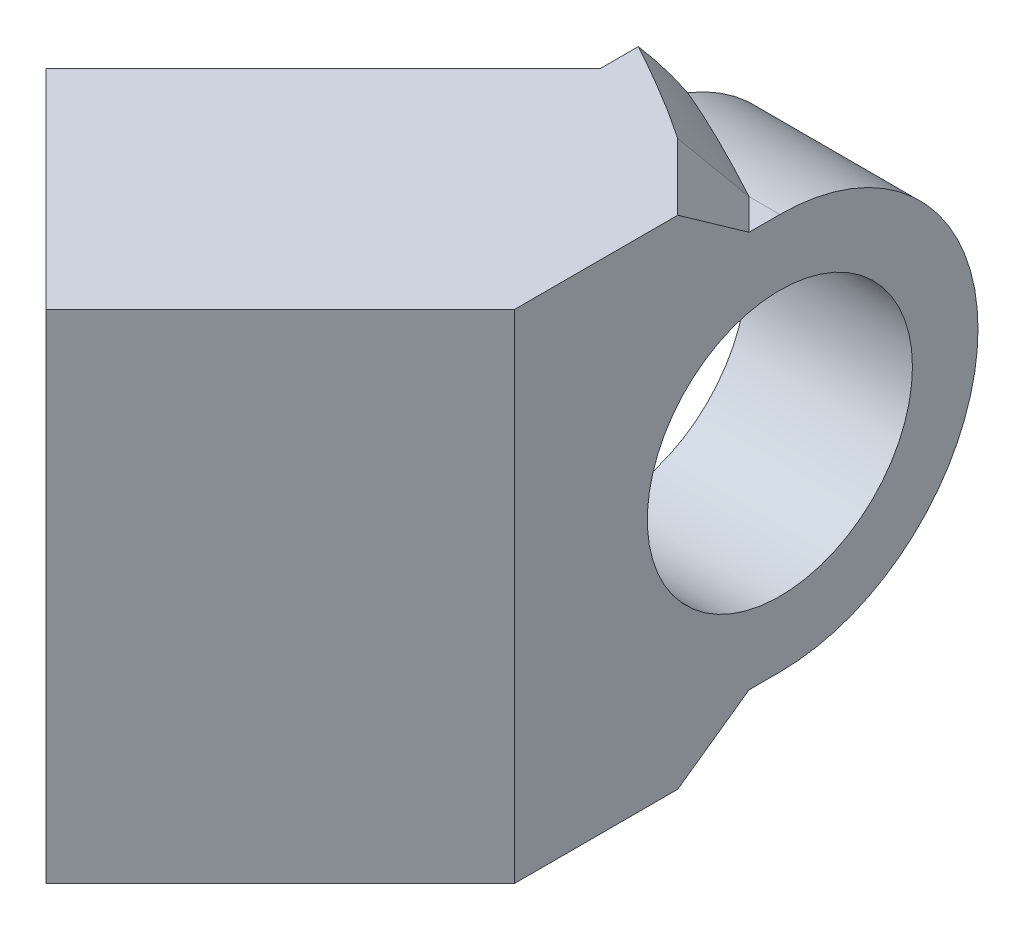
ISO-10303-21;
HEADER;
FILE_DESCRIPTION(('STEP AP214'),'2;1');
FILE_NAME('part.step','',(''),(''),'','','');
FILE_SCHEMA(('AUTOMOTIVE_DESIGN { 1 0 10303 214 1 1 1 1 }'));
ENDSEC;
DATA;
#1=APPLICATION_CONTEXT('core data for automotive mechanical design processes');
#2=APPLICATION_PROTOCOL_DEFINITION('international standard','automotive_design',2000,#1);
#3=PRODUCT_CONTEXT('',#1,'mechanical');
#4=PRODUCT('Part','Part','',(#3));
#5=PRODUCT_RELATED_PRODUCT_CATEGORY('part','',(#4));
#6=PRODUCT_DEFINITION_FORMATION('','',#4);
#7=PRODUCT_DEFINITION_CONTEXT('part definition',#1,'design');
#8=PRODUCT_DEFINITION('design','',#6,#7);
#9=PRODUCT_DEFINITION_SHAPE('','',#8);
#10=(LENGTH_UNIT() NAMED_UNIT(*) SI_UNIT(.MILLI.,.METRE.));
#11=(NAMED_UNIT(*) PLANE_ANGLE_UNIT() SI_UNIT($,.RADIAN.));
#12=(NAMED_UNIT(*) SI_UNIT($,.STERADIAN.) SOLID_ANGLE_UNIT());
#13=UNCERTAINTY_MEASURE_WITH_UNIT(LENGTH_MEASURE(1.E-05),#10,'distance_accuracy_value','');
#14=(GEOMETRIC_REPRESENTATION_CONTEXT(3) GLOBAL_UNCERTAINTY_ASSIGNED_CONTEXT((#13)) GLOBAL_UNIT_ASSIGNED_CONTEXT((#10,
#11,#12)) REPRESENTATION_CONTEXT('',''));
#15=CARTESIAN_POINT('',(0.,0.,0.));
#16=DIRECTION('',(0.,0.,1.));
#17=DIRECTION('',(1.,0.,0.));
#18=AXIS2_PLACEMENT_3D('',#15,#16,#17);
#19=CARTESIAN_POINT('',(9.99999999999999,0.,0.));
#20=DIRECTION('',(1.,0.,0.));
#21=DIRECTION('',(0.,0.,-1.));
#22=AXIS2_PLACEMENT_3D('',#19,#20,#21);
#23=PLANE('',#22);
#24=DIRECTION('',(0.,0.,-1.));
#25=VECTOR('',#24,1.);
#26=CARTESIAN_POINT('',(9.99999999999999,11.9554978606266,21.));
#27=LINE('',#26,#25);
#28=CARTESIAN_POINT('',(9.99999999999999,11.9554978606266,1.8578643762688));
#29=VERTEX_POINT('',#28);
#30=CARTESIAN_POINT('',(9.99999999999999,11.9554978606266,0.));
#31=VERTEX_POINT('',#30);
#32=EDGE_CURVE('E402',#29,#31,#27,.T.);
#33=ORIENTED_EDGE('',*,*,#32,.F.);
#34=DIRECTION('',(0.,-0.577350269189632,-0.816496580927722));
#35=VECTOR('',#34,1.);
#36=CARTESIAN_POINT('',(9.99999999999999,15.8272390903435,7.33333333333334));
#37=LINE('',#36,#35);
#38=CARTESIAN_POINT('',(9.99999999999999,15.,6.16344059244445));
#39=VERTEX_POINT('',#38);
#40=EDGE_CURVE('E252',#29,#39,#37,.F.);
#41=ORIENTED_EDGE('',*,*,#40,.T.);
#42=DIRECTION('',(0.,0.,-1.));
#43=VECTOR('',#42,1.);
#44=CARTESIAN_POINT('',(9.99999999999999,15.,15.9999999999998));
#45=LINE('',#44,#43);
#46=CARTESIAN_POINT('',(9.99999999999999,15.,15.9999999999998));
#47=VERTEX_POINT('',#46);
#48=EDGE_CURVE('E159',#47,#39,#45,.T.);
#49=ORIENTED_EDGE('',*,*,#48,.F.);
#50=DIRECTION('',(0.,-1.,0.));
#51=VECTOR('',#50,1.);
#52=CARTESIAN_POINT('',(9.99999999999999,0.,15.9999999999998));
#53=LINE('',#52,#51);
#54=CARTESIAN_POINT('',(9.99999999999999,-15.,15.9999999999998));
#55=VERTEX_POINT('',#54);
#56=EDGE_CURVE('E78',#47,#55,#53,.T.);
#57=ORIENTED_EDGE('',*,*,#56,.T.);
#58=DIRECTION('',(0.,0.,-1.));
#59=VECTOR('',#58,1.);
#60=CARTESIAN_POINT('',(9.99999999999999,-15.,0.));
#61=LINE('',#60,#59);
#62=CARTESIAN_POINT('',(9.99999999999999,-15.,6.16344059244445));
#63=VERTEX_POINT('',#62);
#64=EDGE_CURVE('E167',#55,#63,#61,.T.);
#65=ORIENTED_EDGE('',*,*,#64,.T.);
#66=DIRECTION('',(0.,-0.577350269189632,0.816496580927722));
#67=VECTOR('',#66,1.);
#68=CARTESIAN_POINT('',(9.99999999999999,-15.8272390903435,7.33333333333334));
#69=LINE('',#68,#67);
#70=CARTESIAN_POINT('',(9.99999999999999,-11.9554978606266,1.8578643762688));
#71=VERTEX_POINT('',#70);
#72=EDGE_CURVE('E429',#63,#71,#69,.F.);
#73=ORIENTED_EDGE('',*,*,#72,.T.);
#74=DIRECTION('',(0.,0.,-1.));
#75=VECTOR('',#74,1.);
#76=CARTESIAN_POINT('',(9.99999999999999,-11.9554978606266,21.));
#77=LINE('',#76,#75);
#78=CARTESIAN_POINT('',(9.99999999999999,-11.9554978606266,0.));
#79=VERTEX_POINT('',#78);
#80=EDGE_CURVE('E413',#71,#79,#77,.T.);
#81=ORIENTED_EDGE('',*,*,#80,.T.);
#82=CARTESIAN_POINT('',(9.99999999999999,0.,0.));
#83=DIRECTION('',(1.,0.,0.));
#84=DIRECTION('',(0.,0.,-1.));
#85=AXIS2_PLACEMENT_3D('',#82,#83,#84);
#86=CIRCLE('',#85,11.9554978606266);
#87=EDGE_CURVE('E273',#79,#31,#86,.T.);
#88=ORIENTED_EDGE('',*,*,#87,.T.);
#89=EDGE_LOOP('',(#33,#41,#49,#57,#65,#73,#81,#88));
#90=FACE_BOUND('',#89,.T.);
#91=CARTESIAN_POINT('',(9.99999999999999,0.,0.));
#92=DIRECTION('',(1.,0.,0.));
#93=DIRECTION('',(0.,0.,-1.));
#94=AXIS2_PLACEMENT_3D('',#91,#92,#93);
#95=CIRCLE('',#94,8.);
#96=CARTESIAN_POINT('',(9.99999999999999,0.,-8.));
#97=VERTEX_POINT('',#96);
#98=EDGE_CURVE('E274',#97,#97,#95,.T.);
#99=ORIENTED_EDGE('',*,*,#98,.F.);
#100=EDGE_LOOP('',(#99));
#101=FACE_BOUND('',#100,.T.);
#102=ADVANCED_FACE('F39',(#90,#101),#23,.T.);
#103=CARTESIAN_POINT('',(0.,0.,0.));
#104=DIRECTION('',(1.,0.,0.));
#105=DIRECTION('',(0.,0.,-1.));
#106=AXIS2_PLACEMENT_3D('',#103,#104,#105);
#107=PLANE('',#106);
#108=CARTESIAN_POINT('',(0.,0.,0.));
#109=DIRECTION('',(1.,0.,0.));
#110=DIRECTION('',(0.,0.,-1.));
#111=AXIS2_PLACEMENT_3D('',#108,#109,#110);
#112=CIRCLE('',#111,11.9554978606266);
#113=CARTESIAN_POINT('',(0.,-11.10304575864,-4.43366552454681));
#114=VERTEX_POINT('',#113);
#115=CARTESIAN_POINT('',(-8.31718187243203E-06,11.1030472919833,-4.43366782591009));
#116=VERTEX_POINT('',#115);
#117=EDGE_CURVE('E259',#114,#116,#112,.T.);
#118=ORIENTED_EDGE('',*,*,#117,.F.);
#119=CARTESIAN_POINT('',(0.,-15.,-1.45560416259163));
#120=CARTESIAN_POINT('',(-1.92092403323275E-07,-14.8263122257042,-1.60586679597316));
#121=CARTESIAN_POINT('',(-5.25012880493377E-06,-14.6514200697399,-1.75473964944493));
#122=CARTESIAN_POINT('',(-1.92034240311627E-05,-14.3049699484894,-2.04477684355861));
#123=CARTESIAN_POINT('',(-2.796790102368E-05,-14.1334897637934,-2.18603411474891));
#124=CARTESIAN_POINT('',(-4.39104498963627E-05,-13.7939637750455,-2.46111670391842));
#125=CARTESIAN_POINT('',(-5.11314018112709E-05,-13.6259919519825,-2.59503330905623));
#126=CARTESIAN_POINT('',(-6.10341287584732E-05,-13.2935715753681,-2.85570561847136));
#127=CARTESIAN_POINT('',(-6.38597721115186E-05,-13.1291933264414,-2.98255096532663));
#128=CARTESIAN_POINT('',(-6.40105782666724E-05,-12.8040382508962,-3.22934839062271));
#129=CARTESIAN_POINT('',(-6.15189124248728E-05,-12.6433281734583,-3.34938839423987));
#130=CARTESIAN_POINT('',(-5.21502556645709E-05,-12.3255773725649,-3.58283832963787));
#131=CARTESIAN_POINT('',(-4.54266738231798E-05,-12.1685999625813,-3.69633442551133));
#132=CARTESIAN_POINT('',(-3.03851009807848E-05,-11.8583726914502,-3.91695575135249));
#133=CARTESIAN_POINT('',(-2.21306259932196E-05,-11.7051828271854,-4.02416532179159));
#134=CARTESIAN_POINT('',(-9.43633451886592E-06,-11.402579679635,-4.23246664856914));
#135=CARTESIAN_POINT('',(-4.87250546276457E-06,-11.2532231915328,-4.33364093082696));
#136=CARTESIAN_POINT('',(-4.36755514556224E-06,-11.103099511282,-4.43366567520715));
#137=B_SPLINE_CURVE_WITH_KNOTS('',3,(#119,#120,#121,#122,#123,#124,#125,#126,#127,#128,#129,
#130,#131,#132,#133,#134,#135,#136),.UNSPECIFIED.,.F.,.F.,(4,2,2,2,2,2,2,2,4),(0.,
0.688991654755253,1.35547044959356,1.99990702438637,2.62276933740995,3.22452221165641,
3.80562690506248,4.36654070488859,4.90771654634916),.UNSPECIFIED.);
#138=CARTESIAN_POINT('',(0.,-15.,-1.45560416259163));
#139=VERTEX_POINT('',#138);
#140=EDGE_CURVE('E157',#114,#139,#137,.F.);
#141=ORIENTED_EDGE('',*,*,#140,.T.);
#142=DIRECTION('',(0.,0.,-1.));
#143=VECTOR('',#142,1.);
#144=CARTESIAN_POINT('',(0.,-15.,0.));
#145=LINE('',#144,#143);
#146=CARTESIAN_POINT('',(0.,-15.,0.807726922469127));
#147=VERTEX_POINT('',#146);
#148=EDGE_CURVE('E54',#147,#139,#145,.T.);
#149=ORIENTED_EDGE('',*,*,#148,.F.);
#150=DIRECTION('',(0.,-1.,0.));
#151=VECTOR('',#150,1.);
#152=CARTESIAN_POINT('',(0.,15.,0.807726922469127));
#153=LINE('',#152,#151);
#154=CARTESIAN_POINT('',(0.,-14.09774876748,0.807726922469129));
#155=VERTEX_POINT('',#154);
#156=EDGE_CURVE('E156',#155,#147,#153,.T.);
#157=ORIENTED_EDGE('',*,*,#156,.F.);
#158=CARTESIAN_POINT('',(0.,0.,0.));
#159=DIRECTION('',(-1.,0.,0.));
#160=DIRECTION('',(0.,0.,1.));
#161=AXIS2_PLACEMENT_3D('',#158,#159,#160);
#162=CIRCLE('',#161,14.1208690629248);
#163=CARTESIAN_POINT('',(0.,14.09774876748,0.807726922469129));
#164=VERTEX_POINT('',#163);
#165=EDGE_CURVE('E373',#155,#164,#162,.T.);
#166=ORIENTED_EDGE('',*,*,#165,.T.);
#167=DIRECTION('',(0.,1.,0.));
#168=VECTOR('',#167,1.);
#169=CARTESIAN_POINT('',(0.,0.,0.807726922469127));
#170=LINE('',#169,#168);
#171=CARTESIAN_POINT('',(0.,15.,0.807726922469127));
#172=VERTEX_POINT('',#171);
#173=EDGE_CURVE('E166',#164,#172,#170,.T.);
#174=ORIENTED_EDGE('',*,*,#173,.T.);
#175=DIRECTION('',(0.,0.,-1.));
#176=VECTOR('',#175,1.);
#177=CARTESIAN_POINT('',(0.,15.,15.9999999999998));
#178=LINE('',#177,#176);
#179=CARTESIAN_POINT('',(0.,15.,-1.45560416259163));
#180=VERTEX_POINT('',#179);
#181=EDGE_CURVE('E11',#172,#180,#178,.T.);
#182=ORIENTED_EDGE('',*,*,#181,.T.);
#183=CARTESIAN_POINT('',(-4.36755515382929E-06,11.103099511282,-4.43366567520715));
#184=CARTESIAN_POINT('',(-4.87250547923278E-06,11.2532231915328,-4.33364093082695));
#185=CARTESIAN_POINT('',(-9.43633453945181E-06,11.402579679635,-4.23246664856912));
#186=CARTESIAN_POINT('',(-2.21306260167042E-05,11.7051828271855,-4.02416532179154));
#187=CARTESIAN_POINT('',(-3.03851010028502E-05,11.8583726914503,-3.91695575135244));
#188=CARTESIAN_POINT('',(-4.5426673839612E-05,12.1685999625814,-3.69633442551125));
#189=CARTESIAN_POINT('',(-5.21502556766903E-05,12.325577372565,-3.58283832963778));
#190=CARTESIAN_POINT('',(-6.15189124306401E-05,12.6433281734584,-3.34938839423977));
#191=CARTESIAN_POINT('',(-6.40105782704867E-05,12.8040382508964,-3.2293483906226));
#192=CARTESIAN_POINT('',(-6.38597721172789E-05,13.1291933264415,-2.98255096532652));
#193=CARTESIAN_POINT('',(-6.10341287683404E-05,13.2935715753682,-2.85570561847125));
#194=CARTESIAN_POINT('',(-5.11314018248864E-05,13.6259919519827,-2.59503330905614));
#195=CARTESIAN_POINT('',(-4.391044990946E-05,13.7939637750456,-2.46111670391833));
#196=CARTESIAN_POINT('',(-2.79679010335131E-05,14.1334897637935,-2.18603411474884));
#197=CARTESIAN_POINT('',(-1.92034240381742E-05,14.3049699484894,-2.04477684355854));
#198=CARTESIAN_POINT('',(-5.25012880694683E-06,14.65142006974,-1.75473964944489));
#199=CARTESIAN_POINT('',(-1.9209240318435E-07,14.8263122257042,-1.60586679597314));
#200=CARTESIAN_POINT('',(0.,15.,-1.45560416259163));
#201=B_SPLINE_CURVE_WITH_KNOTS('',3,(#183,#184,#185,#186,#187,#188,#189,#190,#191,#192,#193,
#194,#195,#196,#197,#198,#199,#200),.UNSPECIFIED.,.F.,.F.,(4,2,2,2,2,2,2,2,4),(0.,
0.541175841460636,1.10208964128681,1.68319433469292,2.2849472089394,2.90780952196295,
3.55224609675573,4.21872489159399,4.90771654634916),.UNSPECIFIED.);
#202=EDGE_CURVE('E257',#180,#116,#201,.F.);
#203=ORIENTED_EDGE('',*,*,#202,.T.);
#204=EDGE_LOOP('',(#118,#141,#149,#157,#166,#174,#182,#203));
#205=FACE_BOUND('',#204,.T.);
#206=CARTESIAN_POINT('',(0.,0.,0.));
#207=DIRECTION('',(1.,0.,0.));
#208=DIRECTION('',(0.,0.,-1.));
#209=AXIS2_PLACEMENT_3D('',#206,#207,#208);
#210=CIRCLE('',#209,8.);
#211=CARTESIAN_POINT('',(0.,0.,-8.));
#212=VERTEX_POINT('',#211);
#213=EDGE_CURVE('E414',#212,#212,#210,.T.);
#214=ORIENTED_EDGE('',*,*,#213,.T.);
#215=EDGE_LOOP('',(#214));
#216=FACE_BOUND('',#215,.T.);
#217=ADVANCED_FACE('F154',(#205,#216),#107,.F.);
#218=CARTESIAN_POINT('',(0.,-11.9554978606266,21.));
#219=DIRECTION('',(0.,1.,0.));
#220=DIRECTION('',(0.,0.,1.));
#221=AXIS2_PLACEMENT_3D('',#218,#219,#220);
#222=PLANE('',#221);
#223=ORIENTED_EDGE('',*,*,#80,.F.);
#224=DIRECTION('',(-0.707106781186551,0.,-0.707106781186544));
#225=VECTOR('',#224,1.);
#226=CARTESIAN_POINT('',(7.07106781186549,-11.9554978606266,-1.07106781186567));
#227=LINE('',#226,#225);
#228=CARTESIAN_POINT('',(8.14213562373118,-11.9554978606266,0.));
#229=VERTEX_POINT('',#228);
#230=EDGE_CURVE('E281',#71,#229,#227,.T.);
#231=ORIENTED_EDGE('',*,*,#230,.T.);
#232=DIRECTION('',(1.,0.,0.));
#233=VECTOR('',#232,1.);
#234=CARTESIAN_POINT('',(0.,-11.9554978606266,0.));
#235=LINE('',#234,#233);
#236=EDGE_CURVE('E388',#229,#79,#235,.T.);
#237=ORIENTED_EDGE('',*,*,#236,.T.);
#238=EDGE_LOOP('',(#223,#231,#237));
#239=FACE_BOUND('',#238,.T.);
#240=ADVANCED_FACE('F212',(#239),#222,.F.);
#241=CARTESIAN_POINT('',(0.,11.9554978606266,21.));
#242=DIRECTION('',(0.,-1.,0.));
#243=DIRECTION('',(0.,0.,-1.));
#244=AXIS2_PLACEMENT_3D('',#241,#242,#243);
#245=PLANE('',#244);
#246=DIRECTION('',(-1.,0.,0.));
#247=VECTOR('',#246,1.);
#248=CARTESIAN_POINT('',(0.,11.9554978606266,0.));
#249=LINE('',#248,#247);
#250=CARTESIAN_POINT('',(8.14213562373117,11.9554978606266,0.));
#251=VERTEX_POINT('',#250);
#252=EDGE_CURVE('E397',#31,#251,#249,.T.);
#253=ORIENTED_EDGE('',*,*,#252,.T.);
#254=DIRECTION('',(0.707106781186551,0.,0.707106781186544));
#255=VECTOR('',#254,1.);
#256=CARTESIAN_POINT('',(17.0710678118655,11.9554978606266,8.92893218813421));
#257=LINE('',#256,#255);
#258=EDGE_CURVE('E307',#251,#29,#257,.T.);
#259=ORIENTED_EDGE('',*,*,#258,.T.);
#260=ORIENTED_EDGE('',*,*,#32,.T.);
#261=EDGE_LOOP('',(#253,#259,#260));
#262=FACE_BOUND('',#261,.T.);
#263=ADVANCED_FACE('F208',(#262),#245,.F.);
#264=CARTESIAN_POINT('',(9.99999999999999,0.,0.));
#265=DIRECTION('',(-1.,0.,0.));
#266=DIRECTION('',(0.,0.,1.));
#267=AXIS2_PLACEMENT_3D('',#264,#265,#266);
#268=CYLINDRICAL_SURFACE('',#267,11.9554978606266);
#269=ORIENTED_EDGE('',*,*,#236,.F.);
#270=CARTESIAN_POINT('',(-0.385836100792198,-11.0167774878707,-4.64376386977142));
#271=CARTESIAN_POINT('',(2.30403019081484,-11.6351457705084,-3.17904232718457));
#272=CARTESIAN_POINT('',(5.22238388746962,-11.9563848832132,-1.58990180309394));
#273=CARTESIAN_POINT('',(8.14213562373115,-11.9554978606266,0.));
#274=B_SPLINE_CURVE_WITH_KNOTS('',3,(#270,#271,#272,#273),.UNSPECIFIED.,.F.,.F.,(4,4),
(1.17187913102305,1.5707963267949),.UNSPECIFIED.);
#275=EDGE_CURVE('E271',#229,#114,#274,.F.);
#276=ORIENTED_EDGE('',*,*,#275,.T.);
#277=ORIENTED_EDGE('',*,*,#117,.T.);
#278=CARTESIAN_POINT('',(8.14213562373117,11.9554978606266,0.));
#279=CARTESIAN_POINT('',(5.22238388746964,11.9563848832132,-1.58990180309391));
#280=CARTESIAN_POINT('',(2.30403019081486,11.6351457705084,-3.17904232718457));
#281=CARTESIAN_POINT('',(-0.385836100792184,11.0167774878707,-4.64376386977141));
#282=B_SPLINE_CURVE_WITH_KNOTS('',3,(#278,#279,#280,#281),.UNSPECIFIED.,.F.,.F.,(4,4),
(4.71238898038469,5.11130617615653),.UNSPECIFIED.);
#283=EDGE_CURVE('E267',#116,#251,#282,.F.);
#284=ORIENTED_EDGE('',*,*,#283,.T.);
#285=ORIENTED_EDGE('',*,*,#252,.F.);
#286=ORIENTED_EDGE('',*,*,#87,.F.);
#287=EDGE_LOOP('',(#269,#276,#277,#284,#285,#286));
#288=FACE_BOUND('',#287,.T.);
#289=ADVANCED_FACE('F211',(#288),#268,.T.);
#290=CARTESIAN_POINT('',(9.99999999999999,0.,0.));
#291=DIRECTION('',(-1.,0.,0.));
#292=DIRECTION('',(0.,0.,1.));
#293=AXIS2_PLACEMENT_3D('',#290,#291,#292);
#294=CYLINDRICAL_SURFACE('',#293,8.);
#295=ORIENTED_EDGE('',*,*,#98,.T.);
#296=EDGE_LOOP('',(#295));
#297=FACE_BOUND('',#296,.T.);
#298=ORIENTED_EDGE('',*,*,#213,.F.);
#299=EDGE_LOOP('',(#298));
#300=FACE_BOUND('',#299,.T.);
#301=ADVANCED_FACE('F206',(#297,#300),#294,.F.);
#302=CARTESIAN_POINT('',(-4.14213562373088,11.9554978606266,30.1421356237308));
#303=DIRECTION('',(-0.707106781186551,0.,-0.707106781186544));
#304=DIRECTION('',(-0.707106781186544,0.,0.707106781186551));
#305=AXIS2_PLACEMENT_3D('',#302,#303,#304);
#306=PLANE('',#305);
#307=ORIENTED_EDGE('',*,*,#56,.F.);
#308=DIRECTION('',(-0.707106781186544,0.,0.707106781186551));
#309=VECTOR('',#308,1.);
#310=CARTESIAN_POINT('',(9.99999999999999,15.,15.9999999999998));
#311=LINE('',#310,#309);
#312=CARTESIAN_POINT('',(-4.14213562373088,15.,30.1421356237308));
#313=VERTEX_POINT('',#312);
#314=EDGE_CURVE('E383',#47,#313,#311,.T.);
#315=ORIENTED_EDGE('',*,*,#314,.T.);
#316=DIRECTION('',(0.,1.,0.));
#317=VECTOR('',#316,1.);
#318=CARTESIAN_POINT('',(-4.14213562373088,11.9554978606266,30.1421356237308));
#319=LINE('',#318,#317);
#320=CARTESIAN_POINT('',(-4.14213562373088,-15.,30.1421356237308));
#321=VERTEX_POINT('',#320);
#322=EDGE_CURVE('E382',#321,#313,#319,.T.);
#323=ORIENTED_EDGE('',*,*,#322,.F.);
#324=DIRECTION('',(-0.707106781186544,0.,0.707106781186551));
#325=VECTOR('',#324,1.);
#326=CARTESIAN_POINT('',(9.99999999999999,-15.,15.9999999999998));
#327=LINE('',#326,#325);
#328=EDGE_CURVE('E148',#55,#321,#327,.T.);
#329=ORIENTED_EDGE('',*,*,#328,.F.);
#330=EDGE_LOOP('',(#307,#315,#323,#329));
#331=FACE_BOUND('',#330,.T.);
#332=ADVANCED_FACE('F202',(#331),#306,.F.);
#333=CARTESIAN_POINT('',(-17.1421356237308,0.,17.142135623731));
#334=DIRECTION('',(-0.707106781186544,0.,0.707106781186551));
#335=DIRECTION('',(0.707106781186551,0.,0.707106781186544));
#336=AXIS2_PLACEMENT_3D('',#333,#334,#335);
#337=PLANE('',#336);
#338=DIRECTION('',(0.707106781186551,0.,0.707106781186544));
#339=VECTOR('',#338,1.);
#340=CARTESIAN_POINT('',(-16.7382721624963,-15.,17.5459990849656));
#341=LINE('',#340,#339);
#342=CARTESIAN_POINT('',(-16.7382721624963,-15.,17.5459990849656));
#343=VERTEX_POINT('',#342);
#344=EDGE_CURVE('E144',#343,#321,#341,.T.);
#345=ORIENTED_EDGE('',*,*,#344,.T.);
#346=ORIENTED_EDGE('',*,*,#322,.T.);
#347=DIRECTION('',(-0.707106781186551,0.,-0.707106781186544));
#348=VECTOR('',#347,1.);
#349=CARTESIAN_POINT('',(-4.14213562373088,15.,30.1421356237308));
#350=LINE('',#349,#348);
#351=CARTESIAN_POINT('',(-16.7382721624963,15.,17.5459990849656));
#352=VERTEX_POINT('',#351);
#353=EDGE_CURVE('E149',#313,#352,#350,.T.);
#354=ORIENTED_EDGE('',*,*,#353,.T.);
#355=DIRECTION('',(0.,-1.,0.));
#356=VECTOR('',#355,1.);
#357=CARTESIAN_POINT('',(-16.7382721624963,15.,17.5459990849656));
#358=LINE('',#357,#356);
#359=EDGE_CURVE('E374',#352,#343,#358,.T.);
#360=ORIENTED_EDGE('',*,*,#359,.T.);
#361=EDGE_LOOP('',(#345,#346,#354,#360));
#362=FACE_BOUND('',#361,.T.);
#363=ADVANCED_FACE('F199',(#362),#337,.T.);
#364=CARTESIAN_POINT('',(-2.59613653876538,15.,3.40386346123454));
#365=DIRECTION('',(-0.707106781186551,0.,-0.707106781186544));
#366=DIRECTION('',(-0.707106781186544,0.,0.707106781186551));
#367=AXIS2_PLACEMENT_3D('',#364,#365,#366);
#368=PLANE('',#367);
#369=DIRECTION('',(-0.707106781186544,0.,0.707106781186551));
#370=VECTOR('',#369,1.);
#371=CARTESIAN_POINT('',(-2.59613653876538,15.,3.40386346123454));
#372=LINE('',#371,#370);
#373=EDGE_CURVE('E86',#172,#352,#372,.T.);
#374=ORIENTED_EDGE('',*,*,#373,.F.);
#375=ORIENTED_EDGE('',*,*,#173,.F.);
#376=CARTESIAN_POINT('',(0.80772692246912,0.,0.));
#377=DIRECTION('',(-0.707106781186551,0.,-0.707106781186544));
#378=DIRECTION('',(0.707106781186544,0.,-0.707106781186551));
#379=AXIS2_PLACEMENT_3D('',#376,#377,#378);
#380=ELLIPSE('',#379,19.9699245412827,14.1208690629248);
#381=EDGE_CURVE('E164',#164,#155,#380,.F.);
#382=ORIENTED_EDGE('',*,*,#381,.T.);
#383=ORIENTED_EDGE('',*,*,#156,.T.);
#384=DIRECTION('',(-0.707106781186544,0.,0.707106781186551));
#385=VECTOR('',#384,1.);
#386=CARTESIAN_POINT('',(-2.59613653876538,-15.,3.40386346123454));
#387=LINE('',#386,#385);
#388=EDGE_CURVE('E137',#147,#343,#387,.T.);
#389=ORIENTED_EDGE('',*,*,#388,.T.);
#390=ORIENTED_EDGE('',*,*,#359,.F.);
#391=EDGE_LOOP('',(#374,#375,#382,#383,#389,#390));
#392=FACE_BOUND('',#391,.T.);
#393=ADVANCED_FACE('F161',(#392),#368,.T.);
#394=CARTESIAN_POINT('',(9.99999999999999,15.,15.9999999999998));
#395=DIRECTION('',(0.,1.,0.));
#396=DIRECTION('',(0.,0.,1.));
#397=AXIS2_PLACEMENT_3D('',#394,#395,#396);
#398=PLANE('',#397);
#399=ORIENTED_EDGE('',*,*,#353,.F.);
#400=ORIENTED_EDGE('',*,*,#314,.F.);
#401=ORIENTED_EDGE('',*,*,#48,.T.);
#402=DIRECTION('',(0.707106781186551,0.,0.707106781186544));
#403=VECTOR('',#402,1.);
#404=CARTESIAN_POINT('',(1.91827970377772,15.,-1.91827970377774));
#405=LINE('',#404,#403);
#406=CARTESIAN_POINT('',(5.98934751564335,15.,2.15278810808785));
#407=VERTEX_POINT('',#406);
#408=EDGE_CURVE('E171',#39,#407,#405,.F.);
#409=ORIENTED_EDGE('',*,*,#408,.T.);
#410=CARTESIAN_POINT('',(0.,15.,-1.45560416259163));
#411=CARTESIAN_POINT('',(0.253719134930265,14.9999949184288,-1.31735468392058));
#412=CARTESIAN_POINT('',(0.506909538283703,14.9999808072131,-1.17812871755042));
#413=CARTESIAN_POINT('',(1.01352461877425,14.9999546447054,-0.896650542911899));
#414=CARTESIAN_POINT('',(1.26694214542454,14.999942605829,-0.754385470207928));
#415=CARTESIAN_POINT('',(1.77382971973547,14.9999412325309,-0.466516479617361));
#416=CARTESIAN_POINT('',(2.02729147270108,14.999952030787,-0.320897938932229));
#417=CARTESIAN_POINT('',(2.53406846562831,14.9999818431099,-0.0259979757971305));
#418=CARTESIAN_POINT('',(2.78737412598596,15.0000009049954,0.123299921481908));
#419=CARTESIAN_POINT('',(3.2905944381701,14.9999991005304,0.424073082650414));
#420=CARTESIAN_POINT('',(3.54052035140194,14.999978477266,0.575529485741834));
#421=CARTESIAN_POINT('',(4.03781390241568,14.9999443051243,0.881570760827176));
#422=CARTESIAN_POINT('',(4.28518541909011,14.9999307432238,1.03614932350926));
#423=CARTESIAN_POINT('',(4.77712665260362,14.9999313344925,1.34879106341821));
#424=CARTESIAN_POINT('',(5.02170043822262,14.999945440294,1.50684782781421));
#425=CARTESIAN_POINT('',(5.50779484733991,14.9999766222809,1.82680173424795));
#426=CARTESIAN_POINT('',(5.74931950640982,14.9999936939711,1.98869274870401));
#427=CARTESIAN_POINT('',(5.98934751564334,15.,2.15278810808785));
#428=B_SPLINE_CURVE_WITH_KNOTS('',3,(#410,#411,#412,#413,#414,#415,#416,#417,#418,#419,#420,
#421,#422,#423,#424,#425,#426,#427),.UNSPECIFIED.,.F.,.F.,(4,2,2,2,2,2,2,2,4),(0.,
0.86682223325359,1.73866945280854,2.61559578816211,3.49766576611437,4.37434993749687,
5.24941146252593,6.12297616643723,6.99522821789292),.UNSPECIFIED.);
#429=EDGE_CURVE('E63',#407,#180,#428,.F.);
#430=ORIENTED_EDGE('',*,*,#429,.T.);
#431=ORIENTED_EDGE('',*,*,#181,.F.);
#432=ORIENTED_EDGE('',*,*,#373,.T.);
#433=EDGE_LOOP('',(#399,#400,#401,#409,#430,#431,#432));
#434=FACE_BOUND('',#433,.T.);
#435=ADVANCED_FACE('F194',(#434),#398,.T.);
#436=CARTESIAN_POINT('',(-2.59613653876538,-15.,3.40386346123454));
#437=DIRECTION('',(0.,-1.,0.));
#438=DIRECTION('',(0.,0.,-1.));
#439=AXIS2_PLACEMENT_3D('',#436,#437,#438);
#440=PLANE('',#439);
#441=ORIENTED_EDGE('',*,*,#388,.F.);
#442=ORIENTED_EDGE('',*,*,#148,.T.);
#443=CARTESIAN_POINT('',(5.98934751564333,-15.,2.15278810808783));
#444=CARTESIAN_POINT('',(5.74931962016488,-14.9999936939822,1.98869282647133));
#445=CARTESIAN_POINT('',(5.50779507625026,-14.9999766223243,1.82680188770784));
#446=CARTESIAN_POINT('',(5.0217008997194,-14.9999454403963,1.50684812889511));
#447=CARTESIAN_POINT('',(4.77712723153198,-14.9999313346215,1.34879143642677));
#448=CARTESIAN_POINT('',(4.28518623480534,-14.9999307433522,1.03614983710796));
#449=CARTESIAN_POINT('',(4.03781483748717,-14.9999443052255,0.88157134308662));
#450=CARTESIAN_POINT('',(3.54052152677069,-14.9999784773086,0.575530202565553));
#451=CARTESIAN_POINT('',(3.29059573448085,-14.9999991005418,0.424073865375751));
#452=CARTESIAN_POINT('',(2.78737542778053,-15.0000009049848,0.123300691599508));
#453=CARTESIAN_POINT('',(2.53406965022489,-14.9999818430711,-0.0259972812760629));
#454=CARTESIAN_POINT('',(2.0272924220237,-14.9999520306967,-0.320897391914139));
#455=CARTESIAN_POINT('',(1.77383055099476,-14.9999412324173,-0.466516004526864));
#456=CARTESIAN_POINT('',(1.26694273997626,-14.9999426057163,-0.75438513575078));
#457=CARTESIAN_POINT('',(1.01352509469214,-14.9999546446167,-0.896650277178536));
#458=CARTESIAN_POINT('',(0.506909776629514,-14.9999808071762,-1.17812858650242));
#459=CARTESIAN_POINT('',(0.253719254346284,-14.9999949184198,-1.31735461884922));
#460=CARTESIAN_POINT('',(0.,-15.,-1.45560416259163));
#461=B_SPLINE_CURVE_WITH_KNOTS('',3,(#443,#444,#445,#446,#447,#448,#449,#450,#451,#452,#453,
#454,#455,#456,#457,#458,#459,#460),.UNSPECIFIED.,.F.,.F.,(4,2,2,2,2,2,2,2,4),(0.,
0.872251638103898,1.74581592906104,2.62087704131049,3.49756079996238,4.37963119592684,
5.25655794586131,6.12840557666605,6.99522821790924),.UNSPECIFIED.);
#462=CARTESIAN_POINT('',(5.98934751564334,-15.,2.15278810808785));
#463=VERTEX_POINT('',#462);
#464=EDGE_CURVE('E178',#139,#463,#461,.F.);
#465=ORIENTED_EDGE('',*,*,#464,.T.);
#466=DIRECTION('',(-0.707106781186551,0.,-0.707106781186544));
#467=VECTOR('',#466,1.);
#468=CARTESIAN_POINT('',(1.91827970377772,-15.,-1.91827970377774));
#469=LINE('',#468,#467);
#470=EDGE_CURVE('E372',#463,#63,#469,.F.);
#471=ORIENTED_EDGE('',*,*,#470,.T.);
#472=ORIENTED_EDGE('',*,*,#64,.F.);
#473=ORIENTED_EDGE('',*,*,#328,.T.);
#474=ORIENTED_EDGE('',*,*,#344,.F.);
#475=EDGE_LOOP('',(#441,#442,#465,#471,#472,#473,#474));
#476=FACE_BOUND('',#475,.T.);
#477=ADVANCED_FACE('F139',(#476),#440,.T.);
#478=CARTESIAN_POINT('',(-26.,0.,0.));
#479=DIRECTION('',(1.,0.,0.));
#480=DIRECTION('',(0.,0.,-1.));
#481=AXIS2_PLACEMENT_3D('',#478,#479,#480);
#482=CYLINDRICAL_SURFACE('',#481,14.1208690629248);
#483=ORIENTED_EDGE('',*,*,#165,.F.);
#484=ORIENTED_EDGE('',*,*,#381,.F.);
#485=EDGE_LOOP('',(#483,#484));
#486=FACE_BOUND('',#485,.T.);
#487=ADVANCED_FACE('F193',(#486),#482,.F.);
#488=CARTESIAN_POINT('',(-2.99999999999995,-21.9554978606268,2.99999999999998));
#489=DIRECTION('',(0.5,-0.707106781186544,-0.500000000000005));
#490=DIRECTION('',(-0.707106781186551,0.,-0.707106781186544));
#491=AXIS2_PLACEMENT_3D('',#488,#489,#490);
#492=PLANE('',#491);
#493=ORIENTED_EDGE('',*,*,#72,.F.);
#494=ORIENTED_EDGE('',*,*,#470,.F.);
#495=CARTESIAN_POINT('',(8.14213562373115,-11.9554978606266,0.));
#496=CARTESIAN_POINT('',(1.07106781186567,-21.9554978606268,7.07106781186555));
#497=B_SPLINE_CURVE_WITH_KNOTS('',1,(#495,#496),.UNSPECIFIED.,.F.,.F.,(2,2),(0.,1.),.UNSPECIFIED.);
#498=EDGE_CURVE('E308',#229,#463,#497,.T.);
#499=ORIENTED_EDGE('',*,*,#498,.F.);
#500=ORIENTED_EDGE('',*,*,#230,.F.);
#501=EDGE_LOOP('',(#493,#494,#499,#500));
#502=FACE_BOUND('',#501,.T.);
#503=ADVANCED_FACE('F328',(#502),#492,.T.);
#504=CARTESIAN_POINT('',(-7.45690391265769,-20.2315986657931,-1.4569039126577));
#505=CARTESIAN_POINT('',(-4.76703762105064,-21.3671919856869,1.23296237894931));
#506=CARTESIAN_POINT('',(-1.84868392439586,-21.9571268201841,4.15131607560406));
#507=CARTESIAN_POINT('',(1.07106781186567,-21.9554978606268,7.07106781186555));
#508=CARTESIAN_POINT('',(-0.385836100792198,-11.0167774878707,-4.64376386977142));
#509=CARTESIAN_POINT('',(2.30403019081484,-11.6351457705084,-3.17904232718457));
#510=CARTESIAN_POINT('',(5.22238388746962,-11.9563848832132,-1.58990180309394));
#511=CARTESIAN_POINT('',(8.14213562373115,-11.9554978606266,0.));
#512=B_SPLINE_SURFACE_WITH_KNOTS('',1,3,((#504,#505,#506,#507),(#508,#509,#510,#511)),
.UNSPECIFIED.,.F.,.F.,.F.,(2,2),(4,4),(0.,1.),(1.17187913102305,1.5707963267949),.UNSPECIFIED.);
#513=ORIENTED_EDGE('',*,*,#140,.F.);
#514=ORIENTED_EDGE('',*,*,#275,.F.);
#515=ORIENTED_EDGE('',*,*,#498,.T.);
#516=ORIENTED_EDGE('',*,*,#464,.F.);
#517=EDGE_LOOP('',(#513,#514,#515,#516));
#518=FACE_BOUND('',#517,.T.);
#519=ADVANCED_FACE('F334',(#518),#512,.T.);
#520=CARTESIAN_POINT('',(1.07106781186568,21.9554978606268,7.07106781186557));
#521=CARTESIAN_POINT('',(-1.84868392439584,21.9571268201841,4.15131607560407));
#522=CARTESIAN_POINT('',(-4.76703762105062,21.3671919856869,1.23296237894933));
#523=CARTESIAN_POINT('',(-7.45690391265767,20.2315986657931,-1.45690391265769));
#524=CARTESIAN_POINT('',(8.14213562373117,11.9554978606266,0.));
#525=CARTESIAN_POINT('',(5.22238388746964,11.9563848832132,-1.58990180309391));
#526=CARTESIAN_POINT('',(2.30403019081486,11.6351457705084,-3.17904232718457));
#527=CARTESIAN_POINT('',(-0.385836100792184,11.0167774878707,-4.64376386977141));
#528=B_SPLINE_SURFACE_WITH_KNOTS('',1,3,((#520,#521,#522,#523),(#524,#525,#526,#527)),
.UNSPECIFIED.,.F.,.F.,.F.,(2,2),(4,4),(0.,1.),(4.71238898038469,5.11130617615653),.UNSPECIFIED.);
#529=CARTESIAN_POINT('',(1.07106781186568,21.9554978606268,7.07106781186557));
#530=CARTESIAN_POINT('',(8.14213562373117,11.9554978606266,0.));
#531=B_SPLINE_CURVE_WITH_KNOTS('',1,(#529,#530),.UNSPECIFIED.,.F.,.F.,(2,2),(0.,1.),.UNSPECIFIED.);
#532=EDGE_CURVE('E279',#251,#407,#531,.F.);
#533=ORIENTED_EDGE('',*,*,#202,.F.);
#534=ORIENTED_EDGE('',*,*,#429,.F.);
#535=ORIENTED_EDGE('',*,*,#532,.F.);
#536=ORIENTED_EDGE('',*,*,#283,.F.);
#537=EDGE_LOOP('',(#533,#534,#535,#536));
#538=FACE_BOUND('',#537,.T.);
#539=ADVANCED_FACE('F42',(#538),#528,.T.);
#540=CARTESIAN_POINT('',(-2.99999999999995,21.9554978606268,2.99999999999998));
#541=DIRECTION('',(0.5,0.707106781186544,-0.500000000000005));
#542=DIRECTION('',(0.707106781186551,0.,0.707106781186544));
#543=AXIS2_PLACEMENT_3D('',#540,#541,#542);
#544=PLANE('',#543);
#545=ORIENTED_EDGE('',*,*,#40,.F.);
#546=ORIENTED_EDGE('',*,*,#258,.F.);
#547=ORIENTED_EDGE('',*,*,#532,.T.);
#548=ORIENTED_EDGE('',*,*,#408,.F.);
#549=EDGE_LOOP('',(#545,#546,#547,#548));
#550=FACE_BOUND('',#549,.T.);
#551=ADVANCED_FACE('F305',(#550),#544,.T.);
#552=CLOSED_SHELL('',(#102,#217,#240,#263,#289,#301,#332,#363,#393,#435,#477,#487,#503,#519,
#539,#551));
#553=MANIFOLD_SOLID_BREP('B2',#552);
#554=ADVANCED_BREP_SHAPE_REPRESENTATION('',(#18,#553),#14);
#555=SHAPE_DEFINITION_REPRESENTATION(#9,#554);
ENDSEC;
END-ISO-10303-21;
